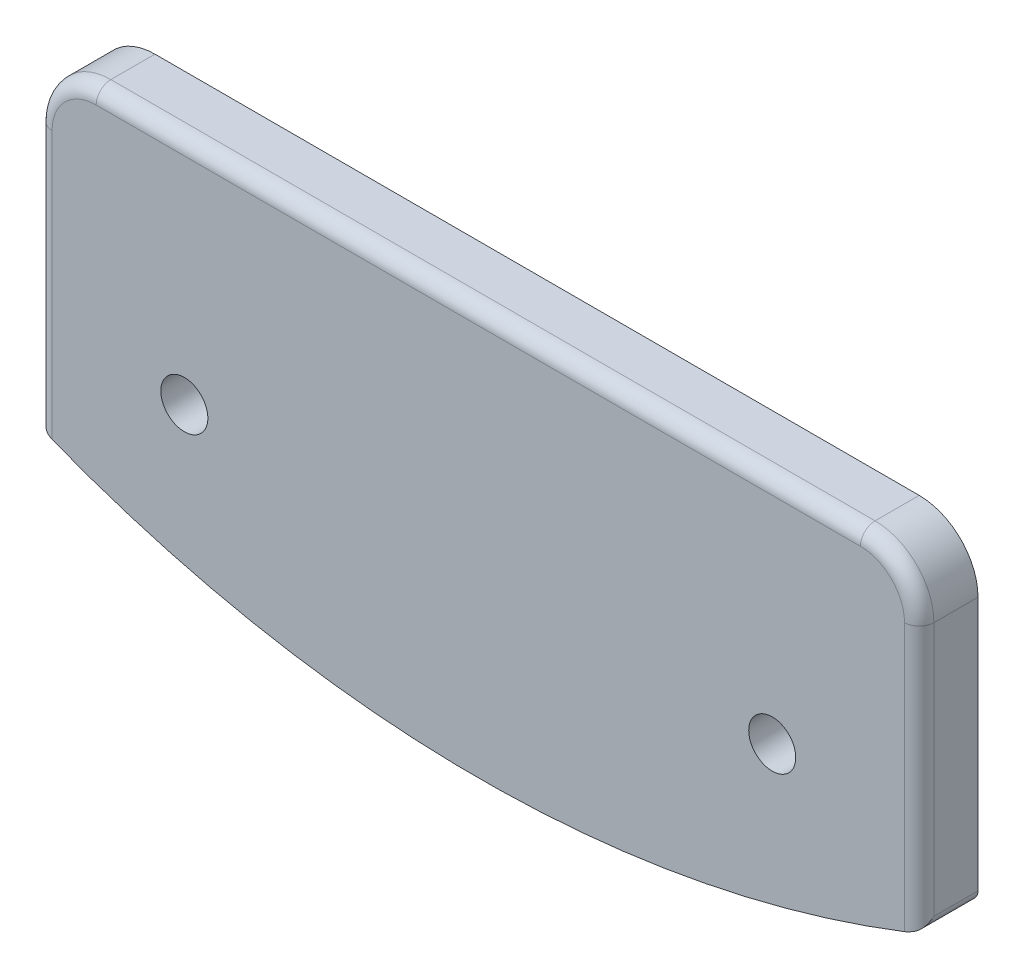
ISO-10303-21;
HEADER;
FILE_DESCRIPTION(('STEP AP214'),'2;1');
FILE_NAME('part.step','',(''),(''),'','','');
FILE_SCHEMA(('AUTOMOTIVE_DESIGN { 1 0 10303 214 1 1 1 1 }'));
ENDSEC;
DATA;
#1=APPLICATION_CONTEXT('core data for automotive mechanical design processes');
#2=APPLICATION_PROTOCOL_DEFINITION('international standard','automotive_design',2000,#1);
#3=PRODUCT_CONTEXT('',#1,'mechanical');
#4=PRODUCT('Part','Part','',(#3));
#5=PRODUCT_RELATED_PRODUCT_CATEGORY('part','',(#4));
#6=PRODUCT_DEFINITION_FORMATION('','',#4);
#7=PRODUCT_DEFINITION_CONTEXT('part definition',#1,'design');
#8=PRODUCT_DEFINITION('design','',#6,#7);
#9=PRODUCT_DEFINITION_SHAPE('','',#8);
#10=(LENGTH_UNIT() NAMED_UNIT(*) SI_UNIT(.MILLI.,.METRE.));
#11=(NAMED_UNIT(*) PLANE_ANGLE_UNIT() SI_UNIT($,.RADIAN.));
#12=(NAMED_UNIT(*) SI_UNIT($,.STERADIAN.) SOLID_ANGLE_UNIT());
#13=UNCERTAINTY_MEASURE_WITH_UNIT(LENGTH_MEASURE(1.E-05),#10,'distance_accuracy_value','');
#14=(GEOMETRIC_REPRESENTATION_CONTEXT(3) GLOBAL_UNCERTAINTY_ASSIGNED_CONTEXT((#13)) GLOBAL_UNIT_ASSIGNED_CONTEXT((#10,
#11,#12)) REPRESENTATION_CONTEXT('',''));
#15=CARTESIAN_POINT('',(0.,0.,0.));
#16=DIRECTION('',(0.,0.,1.));
#17=DIRECTION('',(1.,0.,0.));
#18=AXIS2_PLACEMENT_3D('',#15,#16,#17);
#19=CARTESIAN_POINT('',(26.0000196187948,-56.3500154002329,0.));
#20=DIRECTION('',(0.,0.,1.));
#21=DIRECTION('',(1.,0.,0.));
#22=AXIS2_PLACEMENT_3D('',#19,#20,#21);
#23=PLANE('',#22);
#24=CARTESIAN_POINT('',(0.,0.,0.));
#25=DIRECTION('',(0.,0.,1.));
#26=DIRECTION('',(1.,0.,0.));
#27=AXIS2_PLACEMENT_3D('',#24,#25,#26);
#28=CIRCLE('',#27,80.);
#29=CARTESIAN_POINT('',(-29.5268336845878,-74.3516381296518,0.));
#30=VERTEX_POINT('',#29);
#31=CARTESIAN_POINT('',(29.5268336845878,-74.3516381296518,0.));
#32=VERTEX_POINT('',#31);
#33=EDGE_CURVE('E259',#30,#32,#28,.T.);
#34=ORIENTED_EDGE('',*,*,#33,.F.);
#35=CARTESIAN_POINT('',(-29.2500196187948,-73.6545915221863,0.));
#36=DIRECTION('',(0.,0.,1.));
#37=DIRECTION('',(1.,0.,0.));
#38=AXIS2_PLACEMENT_3D('',#35,#36,#37);
#39=CIRCLE('',#38,0.75);
#40=CARTESIAN_POINT('',(-30.0000196187948,-73.6545915221863,0.));
#41=VERTEX_POINT('',#40);
#42=EDGE_CURVE('E495',#30,#41,#39,.F.);
#43=ORIENTED_EDGE('',*,*,#42,.T.);
#44=DIRECTION('',(0.,-1.,0.));
#45=VECTOR('',#44,1.);
#46=CARTESIAN_POINT('',(-30.0000196187948,-56.3500154002329,0.));
#47=LINE('',#46,#45);
#48=CARTESIAN_POINT('',(-30.0000196187948,-56.3500154002329,0.));
#49=VERTEX_POINT('',#48);
#50=EDGE_CURVE('E257',#49,#41,#47,.T.);
#51=ORIENTED_EDGE('',*,*,#50,.F.);
#52=CARTESIAN_POINT('',(-26.0000196187948,-56.3500154002329,0.));
#53=DIRECTION('',(0.,0.,1.));
#54=DIRECTION('',(-1.,0.,0.));
#55=AXIS2_PLACEMENT_3D('',#52,#53,#54);
#56=CIRCLE('',#55,4.);
#57=CARTESIAN_POINT('',(-26.0000196187948,-52.3500154002329,0.));
#58=VERTEX_POINT('',#57);
#59=EDGE_CURVE('E254',#58,#49,#56,.T.);
#60=ORIENTED_EDGE('',*,*,#59,.F.);
#61=DIRECTION('',(-1.,0.,0.));
#62=VECTOR('',#61,1.);
#63=CARTESIAN_POINT('',(-26.0000196187948,-52.3500154002329,0.));
#64=LINE('',#63,#62);
#65=CARTESIAN_POINT('',(26.0000196187948,-52.3500154002329,0.));
#66=VERTEX_POINT('',#65);
#67=EDGE_CURVE('E251',#66,#58,#64,.T.);
#68=ORIENTED_EDGE('',*,*,#67,.F.);
#69=CARTESIAN_POINT('',(26.0000196187948,-56.3500154002329,0.));
#70=DIRECTION('',(0.,0.,1.));
#71=DIRECTION('',(1.,0.,0.));
#72=AXIS2_PLACEMENT_3D('',#69,#70,#71);
#73=CIRCLE('',#72,4.00000000000001);
#74=CARTESIAN_POINT('',(30.0000196187948,-56.3500154002329,0.));
#75=VERTEX_POINT('',#74);
#76=EDGE_CURVE('E243',#75,#66,#73,.T.);
#77=ORIENTED_EDGE('',*,*,#76,.F.);
#78=DIRECTION('',(0.,1.,0.));
#79=VECTOR('',#78,1.);
#80=CARTESIAN_POINT('',(30.0000196187948,-56.3500154002329,0.));
#81=LINE('',#80,#79);
#82=CARTESIAN_POINT('',(30.0000196187948,-73.6545915221863,0.));
#83=VERTEX_POINT('',#82);
#84=EDGE_CURVE('E262',#83,#75,#81,.T.);
#85=ORIENTED_EDGE('',*,*,#84,.F.);
#86=CARTESIAN_POINT('',(29.2500196187948,-73.6545915221863,0.));
#87=DIRECTION('',(0.,0.,1.));
#88=DIRECTION('',(1.,0.,0.));
#89=AXIS2_PLACEMENT_3D('',#86,#87,#88);
#90=CIRCLE('',#89,0.75);
#91=EDGE_CURVE('E493',#83,#32,#90,.F.);
#92=ORIENTED_EDGE('',*,*,#91,.T.);
#93=EDGE_LOOP('',(#34,#43,#51,#60,#68,#77,#85,#92));
#94=FACE_BOUND('',#93,.T.);
#95=DIRECTION('',(1.,0.,0.));
#96=VECTOR('',#95,1.);
#97=CARTESIAN_POINT('',(-29.0000196187948,-63.9999798183622,0.));
#98=LINE('',#97,#96);
#99=CARTESIAN_POINT('',(-28.0000196187948,-63.9999798183622,0.));
#100=VERTEX_POINT('',#99);
#101=CARTESIAN_POINT('',(4.64999603781112,-63.9999798183622,0.));
#102=VERTEX_POINT('',#101);
#103=EDGE_CURVE('E443',#100,#102,#98,.T.);
#104=ORIENTED_EDGE('',*,*,#103,.T.);
#105=CARTESIAN_POINT('',(4.64999603781112,-62.9999798183622,0.));
#106=DIRECTION('',(0.,0.,1.));
#107=DIRECTION('',(1.,0.,0.));
#108=AXIS2_PLACEMENT_3D('',#105,#106,#107);
#109=CIRCLE('',#108,1.);
#110=CARTESIAN_POINT('',(5.64999603781112,-62.9999798183622,0.));
#111=VERTEX_POINT('',#110);
#112=EDGE_CURVE('E289',#102,#111,#109,.T.);
#113=ORIENTED_EDGE('',*,*,#112,.T.);
#114=DIRECTION('',(0.,1.,0.));
#115=VECTOR('',#114,1.);
#116=CARTESIAN_POINT('',(5.64999603781112,-56.3500154002329,0.));
#117=LINE('',#116,#115);
#118=CARTESIAN_POINT('',(5.64999603781112,-56.3500154002329,0.));
#119=VERTEX_POINT('',#118);
#120=EDGE_CURVE('E442',#111,#119,#117,.T.);
#121=ORIENTED_EDGE('',*,*,#120,.T.);
#122=CARTESIAN_POINT('',(2.64999603781112,-56.3500154002329,0.));
#123=DIRECTION('',(0.,0.,1.));
#124=DIRECTION('',(1.,0.,0.));
#125=AXIS2_PLACEMENT_3D('',#122,#123,#124);
#126=CIRCLE('',#125,3.);
#127=CARTESIAN_POINT('',(2.64999603781112,-53.3500154002329,0.));
#128=VERTEX_POINT('',#127);
#129=EDGE_CURVE('E453',#119,#128,#126,.T.);
#130=ORIENTED_EDGE('',*,*,#129,.T.);
#131=DIRECTION('',(-1.,0.,0.));
#132=VECTOR('',#131,1.);
#133=CARTESIAN_POINT('',(-26.0000196187948,-53.3500154002329,0.));
#134=LINE('',#133,#132);
#135=CARTESIAN_POINT('',(-26.0000196187948,-53.3500154002329,0.));
#136=VERTEX_POINT('',#135);
#137=EDGE_CURVE('E239',#128,#136,#134,.T.);
#138=ORIENTED_EDGE('',*,*,#137,.T.);
#139=CARTESIAN_POINT('',(-26.0000196187948,-56.3500154002329,0.));
#140=DIRECTION('',(0.,0.,1.));
#141=DIRECTION('',(1.,0.,0.));
#142=AXIS2_PLACEMENT_3D('',#139,#140,#141);
#143=CIRCLE('',#142,3.);
#144=CARTESIAN_POINT('',(-29.0000196187948,-56.3500154002329,0.));
#145=VERTEX_POINT('',#144);
#146=EDGE_CURVE('E456',#136,#145,#143,.T.);
#147=ORIENTED_EDGE('',*,*,#146,.T.);
#148=DIRECTION('',(0.,-1.,0.));
#149=VECTOR('',#148,1.);
#150=CARTESIAN_POINT('',(-29.0000196187948,-56.3500154002329,0.));
#151=LINE('',#150,#149);
#152=CARTESIAN_POINT('',(-29.0000196187948,-62.9999798183622,0.));
#153=VERTEX_POINT('',#152);
#154=EDGE_CURVE('E459',#145,#153,#151,.T.);
#155=ORIENTED_EDGE('',*,*,#154,.T.);
#156=CARTESIAN_POINT('',(-28.0000196187948,-62.9999798183622,0.));
#157=DIRECTION('',(0.,0.,1.));
#158=DIRECTION('',(1.,0.,0.));
#159=AXIS2_PLACEMENT_3D('',#156,#157,#158);
#160=CIRCLE('',#159,1.);
#161=EDGE_CURVE('E287',#153,#100,#160,.T.);
#162=ORIENTED_EDGE('',*,*,#161,.T.);
#163=EDGE_LOOP('',(#104,#113,#121,#130,#138,#147,#155,#162));
#164=FACE_BOUND('',#163,.T.);
#165=CARTESIAN_POINT('',(20.,-68.,0.));
#166=DIRECTION('',(0.,0.,1.));
#167=DIRECTION('',(-1.,0.,0.));
#168=AXIS2_PLACEMENT_3D('',#165,#166,#167);
#169=CIRCLE('',#168,1.6);
#170=CARTESIAN_POINT('',(18.4,-68.,0.));
#171=VERTEX_POINT('',#170);
#172=EDGE_CURVE('E439',#171,#171,#169,.T.);
#173=ORIENTED_EDGE('',*,*,#172,.T.);
#174=EDGE_LOOP('',(#173));
#175=FACE_BOUND('',#174,.T.);
#176=CARTESIAN_POINT('',(-20.,-68.,0.));
#177=DIRECTION('',(0.,0.,1.));
#178=DIRECTION('',(1.,0.,0.));
#179=AXIS2_PLACEMENT_3D('',#176,#177,#178);
#180=CIRCLE('',#179,1.6);
#181=CARTESIAN_POINT('',(-18.4,-68.,0.));
#182=VERTEX_POINT('',#181);
#183=EDGE_CURVE('E436',#182,#182,#180,.T.);
#184=ORIENTED_EDGE('',*,*,#183,.T.);
#185=EDGE_LOOP('',(#184));
#186=FACE_BOUND('',#185,.T.);
#187=ADVANCED_FACE('F77',(#94,#164,#175,#186),#23,.F.);
#188=CARTESIAN_POINT('',(26.0000196187948,-56.3500154002329,2.5));
#189=DIRECTION('',(0.,0.,-1.));
#190=DIRECTION('',(-1.,0.,0.));
#191=AXIS2_PLACEMENT_3D('',#188,#189,#190);
#192=CYLINDRICAL_SURFACE('',#191,4.00000000000001);
#193=DIRECTION('',(0.,0.,-1.));
#194=VECTOR('',#193,1.);
#195=CARTESIAN_POINT('',(26.0000196187948,-52.3500154002329,2.5));
#196=LINE('',#195,#194);
#197=CARTESIAN_POINT('',(26.0000196187948,-52.3500154002329,3.));
#198=VERTEX_POINT('',#197);
#199=EDGE_CURVE('E271',#198,#66,#196,.T.);
#200=ORIENTED_EDGE('',*,*,#199,.F.);
#201=CARTESIAN_POINT('',(26.0000196187948,-56.3500154002329,3.));
#202=DIRECTION('',(0.,0.,1.));
#203=DIRECTION('',(1.,0.,0.));
#204=AXIS2_PLACEMENT_3D('',#201,#202,#203);
#205=CIRCLE('',#204,4.00000000000001);
#206=CARTESIAN_POINT('',(30.0000196187948,-56.3500154002329,3.));
#207=VERTEX_POINT('',#206);
#208=EDGE_CURVE('E516',#198,#207,#205,.F.);
#209=ORIENTED_EDGE('',*,*,#208,.T.);
#210=DIRECTION('',(0.,0.,-1.));
#211=VECTOR('',#210,1.);
#212=CARTESIAN_POINT('',(30.0000196187948,-56.3500154002329,2.5));
#213=LINE('',#212,#211);
#214=EDGE_CURVE('E264',#207,#75,#213,.T.);
#215=ORIENTED_EDGE('',*,*,#214,.T.);
#216=ORIENTED_EDGE('',*,*,#76,.T.);
#217=EDGE_LOOP('',(#200,#209,#215,#216));
#218=FACE_BOUND('',#217,.T.);
#219=ADVANCED_FACE('F341',(#218),#192,.T.);
#220=CARTESIAN_POINT('',(-26.0000196187948,-52.3500154002329,2.5));
#221=DIRECTION('',(0.,-1.,0.));
#222=DIRECTION('',(1.,0.,0.));
#223=AXIS2_PLACEMENT_3D('',#220,#221,#222);
#224=PLANE('',#223);
#225=DIRECTION('',(0.,0.,-1.));
#226=VECTOR('',#225,1.);
#227=CARTESIAN_POINT('',(-26.0000196187948,-52.3500154002329,2.5));
#228=LINE('',#227,#226);
#229=CARTESIAN_POINT('',(-26.0000196187948,-52.3500154002329,3.));
#230=VERTEX_POINT('',#229);
#231=EDGE_CURVE('E269',#230,#58,#228,.T.);
#232=ORIENTED_EDGE('',*,*,#231,.F.);
#233=DIRECTION('',(-1.,0.,0.));
#234=VECTOR('',#233,1.);
#235=CARTESIAN_POINT('',(26.0000196187948,-52.3500154002329,3.));
#236=LINE('',#235,#234);
#237=EDGE_CURVE('E490',#230,#198,#236,.F.);
#238=ORIENTED_EDGE('',*,*,#237,.T.);
#239=ORIENTED_EDGE('',*,*,#199,.T.);
#240=ORIENTED_EDGE('',*,*,#67,.T.);
#241=EDGE_LOOP('',(#232,#238,#239,#240));
#242=FACE_BOUND('',#241,.T.);
#243=ADVANCED_FACE('F337',(#242),#224,.F.);
#244=CARTESIAN_POINT('',(-26.0000196187948,-56.3500154002329,2.5));
#245=DIRECTION('',(0.,0.,-1.));
#246=DIRECTION('',(-1.,0.,0.));
#247=AXIS2_PLACEMENT_3D('',#244,#245,#246);
#248=CYLINDRICAL_SURFACE('',#247,4.);
#249=DIRECTION('',(0.,0.,-1.));
#250=VECTOR('',#249,1.);
#251=CARTESIAN_POINT('',(-30.0000196187948,-56.3500154002329,2.5));
#252=LINE('',#251,#250);
#253=CARTESIAN_POINT('',(-30.0000196187948,-56.3500154002329,3.));
#254=VERTEX_POINT('',#253);
#255=EDGE_CURVE('E267',#254,#49,#252,.T.);
#256=ORIENTED_EDGE('',*,*,#255,.F.);
#257=CARTESIAN_POINT('',(-26.0000196187948,-56.3500154002329,3.));
#258=DIRECTION('',(0.,0.,1.));
#259=DIRECTION('',(1.,0.,0.));
#260=AXIS2_PLACEMENT_3D('',#257,#258,#259);
#261=CIRCLE('',#260,4.);
#262=EDGE_CURVE('E520',#254,#230,#261,.F.);
#263=ORIENTED_EDGE('',*,*,#262,.T.);
#264=ORIENTED_EDGE('',*,*,#231,.T.);
#265=ORIENTED_EDGE('',*,*,#59,.T.);
#266=EDGE_LOOP('',(#256,#263,#264,#265));
#267=FACE_BOUND('',#266,.T.);
#268=ADVANCED_FACE('F334',(#267),#248,.T.);
#269=CARTESIAN_POINT('',(-30.0000196187948,-56.3500154002329,2.5));
#270=DIRECTION('',(1.,0.,0.));
#271=DIRECTION('',(0.,1.,0.));
#272=AXIS2_PLACEMENT_3D('',#269,#270,#271);
#273=PLANE('',#272);
#274=ORIENTED_EDGE('',*,*,#50,.T.);
#275=DIRECTION('',(0.,0.,-1.));
#276=VECTOR('',#275,1.);
#277=CARTESIAN_POINT('',(-30.0000196187948,-73.6545915221863,2.5));
#278=LINE('',#277,#276);
#279=CARTESIAN_POINT('',(-30.0000196187948,-73.6545915221863,3.));
#280=VERTEX_POINT('',#279);
#281=EDGE_CURVE('E104',#41,#280,#278,.F.);
#282=ORIENTED_EDGE('',*,*,#281,.T.);
#283=DIRECTION('',(0.,1.,0.));
#284=VECTOR('',#283,1.);
#285=CARTESIAN_POINT('',(-30.0000196187948,-56.3500154002329,3.));
#286=LINE('',#285,#284);
#287=EDGE_CURVE('E514',#280,#254,#286,.T.);
#288=ORIENTED_EDGE('',*,*,#287,.T.);
#289=ORIENTED_EDGE('',*,*,#255,.T.);
#290=EDGE_LOOP('',(#274,#282,#288,#289));
#291=FACE_BOUND('',#290,.T.);
#292=ADVANCED_FACE('F328',(#291),#273,.F.);
#293=CARTESIAN_POINT('',(0.,0.,2.5));
#294=DIRECTION('',(0.,0.,-1.));
#295=DIRECTION('',(-1.,0.,0.));
#296=AXIS2_PLACEMENT_3D('',#293,#294,#295);
#297=CYLINDRICAL_SURFACE('',#296,80.);
#298=CARTESIAN_POINT('',(-29.0000196187948,-74.5586940745982,4.));
#299=CARTESIAN_POINT('',(-29.0596066132517,-74.5355205735566,4.00003040887928));
#300=CARTESIAN_POINT('',(-29.1191707824708,-74.5122674149781,3.99467519871337));
#301=CARTESIAN_POINT('',(-29.2366749276347,-74.4662386559322,3.9734207634563));
#302=CARTESIAN_POINT('',(-29.2946125126244,-74.4434637697249,3.95750678524867));
#303=CARTESIAN_POINT('',(-29.4071707532458,-74.3990726286106,3.91534006679412));
#304=CARTESIAN_POINT('',(-29.4617876831406,-74.3774576782158,3.88907595219497));
#305=CARTESIAN_POINT('',(-29.5658726273493,-74.3361439804414,3.82673141956986));
#306=CARTESIAN_POINT('',(-29.6153444675297,-74.3164438099633,3.79065836862866));
#307=CARTESIAN_POINT('',(-29.7057964856069,-74.2803335388721,3.71090575298693));
#308=CARTESIAN_POINT('',(-29.7470131973515,-74.2638324456298,3.66753646207224));
#309=CARTESIAN_POINT('',(-29.8214594050831,-74.2339691266905,3.57343766371094));
#310=CARTESIAN_POINT('',(-29.8546895600229,-74.2206066420358,3.52270876404342));
#311=CARTESIAN_POINT('',(-29.9096499582194,-74.1984747662587,3.41923739568762));
#312=CARTESIAN_POINT('',(-29.9320300726255,-74.1894462717466,3.36689482698829));
#313=CARTESIAN_POINT('',(-29.9676331731695,-74.1750722059981,3.25874777742881));
#314=CARTESIAN_POINT('',(-29.9808721471293,-74.1697202046726,3.20294952781644));
#315=CARTESIAN_POINT('',(-29.9928330734515,-74.1648837093477,3.12216735514846));
#316=CARTESIAN_POINT('',(-29.9955273217284,-74.1637940334967,3.09780654222436));
#317=CARTESIAN_POINT('',(-29.9991189390364,-74.1623412902509,3.04896821148646));
#318=CARTESIAN_POINT('',(-30.0000190078712,-74.1619771311305,3.02449092466167));
#319=CARTESIAN_POINT('',(-30.0000196187948,-74.1619769347604,3.));
#320=B_SPLINE_CURVE_WITH_KNOTS('',3,(#298,#299,#300,#301,#302,#303,#304,#305,#306,#307,#308,
#309,#310,#311,#312,#313,#314,#315,#316,#317,#318,#319),.UNSPECIFIED.,.F.,.F.,(4,2,2,2,2,2,2,2,
2,2,4),(0.,0.191595903311774,0.383460077132389,0.575535692021743,0.767467443458432,
0.952684305639938,1.13788588074229,1.30991380439227,1.4816400844466,1.55517737896761,
1.62860393396581),.UNSPECIFIED.);
#321=CARTESIAN_POINT('',(-29.0000196187948,-74.5586940745982,4.));
#322=VERTEX_POINT('',#321);
#323=CARTESIAN_POINT('',(-29.5268336845878,-74.3516381296518,3.84998055276732));
#324=VERTEX_POINT('',#323);
#325=EDGE_CURVE('E304',#322,#324,#320,.T.);
#326=ORIENTED_EDGE('',*,*,#325,.T.);
#327=DIRECTION('',(0.,0.,-1.));
#328=VECTOR('',#327,1.);
#329=CARTESIAN_POINT('',(-29.5268336845878,-74.3516381296518,2.5));
#330=LINE('',#329,#328);
#331=EDGE_CURVE('E489',#324,#30,#330,.T.);
#332=ORIENTED_EDGE('',*,*,#331,.T.);
#333=ORIENTED_EDGE('',*,*,#33,.T.);
#334=DIRECTION('',(0.,0.,-1.));
#335=VECTOR('',#334,1.);
#336=CARTESIAN_POINT('',(29.5268336845879,-74.3516381296518,2.5));
#337=LINE('',#336,#335);
#338=CARTESIAN_POINT('',(29.5268336845878,-74.3516381296518,3.84998055276733));
#339=VERTEX_POINT('',#338);
#340=EDGE_CURVE('E487',#32,#339,#337,.F.);
#341=ORIENTED_EDGE('',*,*,#340,.T.);
#342=CARTESIAN_POINT('',(30.0000196187948,-74.1619769347604,3.));
#343=CARTESIAN_POINT('',(30.0000204471864,-74.1619765117537,3.02667039500805));
#344=CARTESIAN_POINT('',(29.9989519060468,-74.1624088549921,3.05332742731168));
#345=CARTESIAN_POINT('',(29.9946958227748,-74.1641303488611,3.10643860030182));
#346=CARTESIAN_POINT('',(29.991508708532,-74.1654193264765,3.13289278086731));
#347=CARTESIAN_POINT('',(29.9788292751922,-74.1705459288987,3.21151195535693));
#348=CARTESIAN_POINT('',(29.9662185319932,-74.1756433682887,3.26313007202984));
#349=CARTESIAN_POINT('',(29.9331807355927,-74.188981685613,3.36331344022252));
#350=CARTESIAN_POINT('',(29.912755713902,-74.1972217465452,3.41187948138584));
#351=CARTESIAN_POINT('',(29.8648395732017,-74.2165212214526,3.50479630164745));
#352=CARTESIAN_POINT('',(29.8373455806723,-74.2275817819393,3.54914535648474));
#353=CARTESIAN_POINT('',(29.7752714879351,-74.2525040445443,3.63389957877525));
#354=CARTESIAN_POINT('',(29.7404993988107,-74.2664414580651,3.67414142756564));
#355=CARTESIAN_POINT('',(29.6655161872453,-74.2964250738845,3.74826164768769));
#356=CARTESIAN_POINT('',(29.625303620626,-74.3124718360789,3.7821383236569));
#357=CARTESIAN_POINT('',(29.5376242375645,-74.3473679879536,3.84503805213167));
#358=CARTESIAN_POINT('',(29.4898483517624,-74.366334352758,3.87356503982904));
#359=CARTESIAN_POINT('',(29.3906759485487,-74.4055845638369,3.92219275432681));
#360=CARTESIAN_POINT('',(29.3392782216078,-74.4258688500589,3.94229065046985));
#361=CARTESIAN_POINT('',(29.2401314996153,-74.4648723002924,3.97196332501763));
#362=CARTESIAN_POINT('',(29.1926258096567,-74.4835095729307,3.98247007043714));
#363=CARTESIAN_POINT('',(29.0967605231391,-74.5210119718934,3.99648880931951));
#364=CARTESIAN_POINT('',(29.0484022415218,-74.5398767352101,4.0000107606433));
#365=CARTESIAN_POINT('',(29.0000196187948,-74.5586940745981,4.));
#366=B_SPLINE_CURVE_WITH_KNOTS('',3,(#342,#343,#344,#345,#346,#347,#348,#349,#350,#351,#352,
#353,#354,#355,#356,#357,#358,#359,#360,#361,#362,#363,#364,#365),.UNSPECIFIED.,.F.,.F.,(4,2,2,
2,2,2,2,2,2,2,2,4),(0.,0.0799600506266316,0.159903956570993,0.319210093359065,0.478474842770324,
0.637804435559398,0.802036023955479,0.966311293583594,1.14191945229099,1.31758653659783,
1.47341836946172,1.62902788075246),.UNSPECIFIED.);
#367=CARTESIAN_POINT('',(29.0000196187948,-74.5586940745981,4.));
#368=VERTEX_POINT('',#367);
#369=EDGE_CURVE('E313',#339,#368,#366,.T.);
#370=ORIENTED_EDGE('',*,*,#369,.T.);
#371=CARTESIAN_POINT('',(0.,0.,4.));
#372=DIRECTION('',(0.,0.,1.));
#373=DIRECTION('',(1.,0.,0.));
#374=AXIS2_PLACEMENT_3D('',#371,#372,#373);
#375=CIRCLE('',#374,80.);
#376=EDGE_CURVE('E419',#322,#368,#375,.T.);
#377=ORIENTED_EDGE('',*,*,#376,.F.);
#378=EDGE_LOOP('',(#326,#332,#333,#341,#370,#377));
#379=FACE_BOUND('',#378,.T.);
#380=ADVANCED_FACE('F322',(#379),#297,.T.);
#381=CARTESIAN_POINT('',(30.0000196187948,-56.3500154002329,2.5));
#382=DIRECTION('',(-1.,0.,0.));
#383=DIRECTION('',(0.,-1.,0.));
#384=AXIS2_PLACEMENT_3D('',#381,#382,#383);
#385=PLANE('',#384);
#386=DIRECTION('',(0.,1.,0.));
#387=VECTOR('',#386,1.);
#388=CARTESIAN_POINT('',(30.0000196187948,-74.1619769347604,3.));
#389=LINE('',#388,#387);
#390=CARTESIAN_POINT('',(30.0000196187948,-73.6545915221863,3.));
#391=VERTEX_POINT('',#390);
#392=EDGE_CURVE('E302',#207,#391,#389,.F.);
#393=ORIENTED_EDGE('',*,*,#392,.T.);
#394=DIRECTION('',(0.,0.,-1.));
#395=VECTOR('',#394,1.);
#396=CARTESIAN_POINT('',(30.0000196187948,-73.6545915221863,2.5));
#397=LINE('',#396,#395);
#398=EDGE_CURVE('E91',#391,#83,#397,.T.);
#399=ORIENTED_EDGE('',*,*,#398,.T.);
#400=ORIENTED_EDGE('',*,*,#84,.T.);
#401=ORIENTED_EDGE('',*,*,#214,.F.);
#402=EDGE_LOOP('',(#393,#399,#400,#401));
#403=FACE_BOUND('',#402,.T.);
#404=ADVANCED_FACE('F327',(#403),#385,.F.);
#405=CARTESIAN_POINT('',(5.64999603781112,-56.3500154002329,2.5));
#406=DIRECTION('',(-1.,0.,0.));
#407=DIRECTION('',(0.,-1.,0.));
#408=AXIS2_PLACEMENT_3D('',#405,#406,#407);
#409=PLANE('',#408);
#410=ORIENTED_EDGE('',*,*,#120,.F.);
#411=DIRECTION('',(0.,0.,-1.));
#412=VECTOR('',#411,1.);
#413=CARTESIAN_POINT('',(5.64999603781112,-62.9999798183622,2.5));
#414=LINE('',#413,#412);
#415=CARTESIAN_POINT('',(5.64999603781112,-62.9999798183622,2.5));
#416=VERTEX_POINT('',#415);
#417=EDGE_CURVE('E285',#111,#416,#414,.F.);
#418=ORIENTED_EDGE('',*,*,#417,.T.);
#419=DIRECTION('',(0.,1.,0.));
#420=VECTOR('',#419,1.);
#421=CARTESIAN_POINT('',(5.64999603781112,-56.3500154002329,2.5));
#422=LINE('',#421,#420);
#423=CARTESIAN_POINT('',(5.64999603781112,-56.3500154002329,2.5));
#424=VERTEX_POINT('',#423);
#425=EDGE_CURVE('E235',#416,#424,#422,.T.);
#426=ORIENTED_EDGE('',*,*,#425,.T.);
#427=DIRECTION('',(0.,0.,-1.));
#428=VECTOR('',#427,1.);
#429=CARTESIAN_POINT('',(5.64999603781112,-56.3500154002329,2.5));
#430=LINE('',#429,#428);
#431=EDGE_CURVE('E234',#424,#119,#430,.T.);
#432=ORIENTED_EDGE('',*,*,#431,.T.);
#433=EDGE_LOOP('',(#410,#418,#426,#432));
#434=FACE_BOUND('',#433,.T.);
#435=ADVANCED_FACE('F382',(#434),#409,.T.);
#436=CARTESIAN_POINT('',(2.64999603781112,-56.3500154002329,2.5));
#437=DIRECTION('',(0.,0.,-1.));
#438=DIRECTION('',(-1.,0.,0.));
#439=AXIS2_PLACEMENT_3D('',#436,#437,#438);
#440=CYLINDRICAL_SURFACE('',#439,3.);
#441=ORIENTED_EDGE('',*,*,#129,.F.);
#442=ORIENTED_EDGE('',*,*,#431,.F.);
#443=CARTESIAN_POINT('',(2.64999603781112,-56.3500154002329,2.5));
#444=DIRECTION('',(0.,0.,1.));
#445=DIRECTION('',(1.,0.,0.));
#446=AXIS2_PLACEMENT_3D('',#443,#444,#445);
#447=CIRCLE('',#446,3.);
#448=CARTESIAN_POINT('',(2.64999603781112,-53.3500154002329,2.5));
#449=VERTEX_POINT('',#448);
#450=EDGE_CURVE('E220',#424,#449,#447,.T.);
#451=ORIENTED_EDGE('',*,*,#450,.T.);
#452=DIRECTION('',(0.,0.,-1.));
#453=VECTOR('',#452,1.);
#454=CARTESIAN_POINT('',(2.64999603781112,-53.3500154002329,2.5));
#455=LINE('',#454,#453);
#456=EDGE_CURVE('E231',#449,#128,#455,.T.);
#457=ORIENTED_EDGE('',*,*,#456,.T.);
#458=EDGE_LOOP('',(#441,#442,#451,#457));
#459=FACE_BOUND('',#458,.T.);
#460=ADVANCED_FACE('F230',(#459),#440,.F.);
#461=CARTESIAN_POINT('',(-26.0000196187948,-53.3500154002329,2.5));
#462=DIRECTION('',(0.,-1.,0.));
#463=DIRECTION('',(0.,0.,-1.));
#464=AXIS2_PLACEMENT_3D('',#461,#462,#463);
#465=PLANE('',#464);
#466=ORIENTED_EDGE('',*,*,#137,.F.);
#467=ORIENTED_EDGE('',*,*,#456,.F.);
#468=DIRECTION('',(-1.,0.,0.));
#469=VECTOR('',#468,1.);
#470=CARTESIAN_POINT('',(-26.0000196187948,-53.3500154002329,2.5));
#471=LINE('',#470,#469);
#472=CARTESIAN_POINT('',(-26.0000196187948,-53.3500154002329,2.5));
#473=VERTEX_POINT('',#472);
#474=EDGE_CURVE('E215',#449,#473,#471,.T.);
#475=ORIENTED_EDGE('',*,*,#474,.T.);
#476=DIRECTION('',(0.,0.,-1.));
#477=VECTOR('',#476,1.);
#478=CARTESIAN_POINT('',(-26.0000196187948,-53.3500154002329,2.5));
#479=LINE('',#478,#477);
#480=EDGE_CURVE('E241',#473,#136,#479,.T.);
#481=ORIENTED_EDGE('',*,*,#480,.T.);
#482=EDGE_LOOP('',(#466,#467,#475,#481));
#483=FACE_BOUND('',#482,.T.);
#484=ADVANCED_FACE('F237',(#483),#465,.T.);
#485=CARTESIAN_POINT('',(-26.0000196187948,-56.3500154002329,2.5));
#486=DIRECTION('',(0.,0.,-1.));
#487=DIRECTION('',(-1.,0.,0.));
#488=AXIS2_PLACEMENT_3D('',#485,#486,#487);
#489=CYLINDRICAL_SURFACE('',#488,3.);
#490=ORIENTED_EDGE('',*,*,#146,.F.);
#491=ORIENTED_EDGE('',*,*,#480,.F.);
#492=CARTESIAN_POINT('',(-26.0000196187948,-56.3500154002329,2.5));
#493=DIRECTION('',(0.,0.,1.));
#494=DIRECTION('',(1.,0.,0.));
#495=AXIS2_PLACEMENT_3D('',#492,#493,#494);
#496=CIRCLE('',#495,3.);
#497=CARTESIAN_POINT('',(-29.0000196187948,-56.3500154002329,2.5));
#498=VERTEX_POINT('',#497);
#499=EDGE_CURVE('E223',#473,#498,#496,.T.);
#500=ORIENTED_EDGE('',*,*,#499,.T.);
#501=DIRECTION('',(0.,0.,-1.));
#502=VECTOR('',#501,1.);
#503=CARTESIAN_POINT('',(-29.0000196187948,-56.3500154002329,2.5));
#504=LINE('',#503,#502);
#505=EDGE_CURVE('E245',#498,#145,#504,.T.);
#506=ORIENTED_EDGE('',*,*,#505,.T.);
#507=EDGE_LOOP('',(#490,#491,#500,#506));
#508=FACE_BOUND('',#507,.T.);
#509=ADVANCED_FACE('F390',(#508),#489,.F.);
#510=CARTESIAN_POINT('',(-29.0000196187948,-56.3500154002329,2.5));
#511=DIRECTION('',(1.,0.,0.));
#512=DIRECTION('',(0.,0.,-1.));
#513=AXIS2_PLACEMENT_3D('',#510,#511,#512);
#514=PLANE('',#513);
#515=DIRECTION('',(0.,-1.,0.));
#516=VECTOR('',#515,1.);
#517=CARTESIAN_POINT('',(-29.0000196187948,-56.3500154002329,2.5));
#518=LINE('',#517,#516);
#519=CARTESIAN_POINT('',(-29.0000196187948,-62.9999798183622,2.5));
#520=VERTEX_POINT('',#519);
#521=EDGE_CURVE('E446',#498,#520,#518,.T.);
#522=ORIENTED_EDGE('',*,*,#521,.T.);
#523=DIRECTION('',(0.,0.,-1.));
#524=VECTOR('',#523,1.);
#525=CARTESIAN_POINT('',(-29.0000196187948,-62.9999798183622,0.));
#526=LINE('',#525,#524);
#527=EDGE_CURVE('E273',#520,#153,#526,.T.);
#528=ORIENTED_EDGE('',*,*,#527,.T.);
#529=ORIENTED_EDGE('',*,*,#154,.F.);
#530=ORIENTED_EDGE('',*,*,#505,.F.);
#531=EDGE_LOOP('',(#522,#528,#529,#530));
#532=FACE_BOUND('',#531,.T.);
#533=ADVANCED_FACE('F393',(#532),#514,.T.);
#534=CARTESIAN_POINT('',(-29.0000196187948,-63.9999798183622,2.5));
#535=DIRECTION('',(0.,1.,0.));
#536=DIRECTION('',(0.,0.,1.));
#537=AXIS2_PLACEMENT_3D('',#534,#535,#536);
#538=PLANE('',#537);
#539=ORIENTED_EDGE('',*,*,#103,.F.);
#540=DIRECTION('',(0.,0.,-1.));
#541=VECTOR('',#540,1.);
#542=CARTESIAN_POINT('',(-28.0000196187948,-63.9999798183622,2.5));
#543=LINE('',#542,#541);
#544=CARTESIAN_POINT('',(-28.0000196187948,-63.9999798183622,2.5));
#545=VERTEX_POINT('',#544);
#546=EDGE_CURVE('E279',#100,#545,#543,.F.);
#547=ORIENTED_EDGE('',*,*,#546,.T.);
#548=DIRECTION('',(1.,0.,0.));
#549=VECTOR('',#548,1.);
#550=CARTESIAN_POINT('',(-29.0000196187948,-63.9999798183622,2.5));
#551=LINE('',#550,#549);
#552=CARTESIAN_POINT('',(4.64999603781112,-63.9999798183622,2.5));
#553=VERTEX_POINT('',#552);
#554=EDGE_CURVE('E449',#545,#553,#551,.T.);
#555=ORIENTED_EDGE('',*,*,#554,.T.);
#556=DIRECTION('',(0.,0.,-1.));
#557=VECTOR('',#556,1.);
#558=CARTESIAN_POINT('',(4.64999603781112,-63.9999798183622,0.));
#559=LINE('',#558,#557);
#560=EDGE_CURVE('E276',#553,#102,#559,.T.);
#561=ORIENTED_EDGE('',*,*,#560,.T.);
#562=EDGE_LOOP('',(#539,#547,#555,#561));
#563=FACE_BOUND('',#562,.T.);
#564=ADVANCED_FACE('F397',(#563),#538,.T.);
#565=CARTESIAN_POINT('',(20.,-68.,2.5));
#566=DIRECTION('',(0.,0.,-1.));
#567=DIRECTION('',(-1.,0.,0.));
#568=AXIS2_PLACEMENT_3D('',#565,#566,#567);
#569=CYLINDRICAL_SURFACE('',#568,1.6);
#570=ORIENTED_EDGE('',*,*,#172,.F.);
#571=EDGE_LOOP('',(#570));
#572=FACE_BOUND('',#571,.T.);
#573=CARTESIAN_POINT('',(20.,-68.,4.));
#574=DIRECTION('',(0.,0.,1.));
#575=DIRECTION('',(1.,0.,0.));
#576=AXIS2_PLACEMENT_3D('',#573,#574,#575);
#577=CIRCLE('',#576,1.6);
#578=CARTESIAN_POINT('',(21.6,-68.,4.));
#579=VERTEX_POINT('',#578);
#580=EDGE_CURVE('E427',#579,#579,#577,.T.);
#581=ORIENTED_EDGE('',*,*,#580,.T.);
#582=EDGE_LOOP('',(#581));
#583=FACE_BOUND('',#582,.T.);
#584=ADVANCED_FACE('F401',(#572,#583),#569,.F.);
#585=CARTESIAN_POINT('',(-20.,-68.,2.5));
#586=DIRECTION('',(0.,0.,-1.));
#587=DIRECTION('',(-1.,0.,0.));
#588=AXIS2_PLACEMENT_3D('',#585,#586,#587);
#589=CYLINDRICAL_SURFACE('',#588,1.6);
#590=ORIENTED_EDGE('',*,*,#183,.F.);
#591=EDGE_LOOP('',(#590));
#592=FACE_BOUND('',#591,.T.);
#593=CARTESIAN_POINT('',(-20.,-68.,4.));
#594=DIRECTION('',(0.,0.,1.));
#595=DIRECTION('',(1.,0.,0.));
#596=AXIS2_PLACEMENT_3D('',#593,#594,#595);
#597=CIRCLE('',#596,1.6);
#598=CARTESIAN_POINT('',(-18.4,-68.,4.));
#599=VERTEX_POINT('',#598);
#600=EDGE_CURVE('E424',#599,#599,#597,.T.);
#601=ORIENTED_EDGE('',*,*,#600,.T.);
#602=EDGE_LOOP('',(#601));
#603=FACE_BOUND('',#602,.T.);
#604=ADVANCED_FACE('F405',(#592,#603),#589,.F.);
#605=CARTESIAN_POINT('',(-26.0000196187948,-56.3500154002329,2.5));
#606=DIRECTION('',(0.,0.,1.));
#607=DIRECTION('',(1.,0.,0.));
#608=AXIS2_PLACEMENT_3D('',#605,#606,#607);
#609=PLANE('',#608);
#610=ORIENTED_EDGE('',*,*,#554,.F.);
#611=CARTESIAN_POINT('',(-28.0000196187948,-62.9999798183622,2.5));
#612=DIRECTION('',(0.,0.,1.));
#613=DIRECTION('',(1.,0.,0.));
#614=AXIS2_PLACEMENT_3D('',#611,#612,#613);
#615=CIRCLE('',#614,1.);
#616=EDGE_CURVE('E283',#545,#520,#615,.F.);
#617=ORIENTED_EDGE('',*,*,#616,.T.);
#618=ORIENTED_EDGE('',*,*,#521,.F.);
#619=ORIENTED_EDGE('',*,*,#499,.F.);
#620=ORIENTED_EDGE('',*,*,#474,.F.);
#621=ORIENTED_EDGE('',*,*,#450,.F.);
#622=ORIENTED_EDGE('',*,*,#425,.F.);
#623=CARTESIAN_POINT('',(4.64999603781112,-62.9999798183622,2.5));
#624=DIRECTION('',(0.,0.,1.));
#625=DIRECTION('',(1.,0.,0.));
#626=AXIS2_PLACEMENT_3D('',#623,#624,#625);
#627=CIRCLE('',#626,1.);
#628=EDGE_CURVE('E281',#416,#553,#627,.F.);
#629=ORIENTED_EDGE('',*,*,#628,.T.);
#630=EDGE_LOOP('',(#610,#617,#618,#619,#620,#621,#622,#629));
#631=FACE_BOUND('',#630,.T.);
#632=ADVANCED_FACE('F218',(#631),#609,.F.);
#633=CARTESIAN_POINT('',(-26.0000196187948,-56.3500154002329,4.));
#634=DIRECTION('',(0.,0.,1.));
#635=DIRECTION('',(1.,0.,0.));
#636=AXIS2_PLACEMENT_3D('',#633,#634,#635);
#637=PLANE('',#636);
#638=ORIENTED_EDGE('',*,*,#376,.T.);
#639=DIRECTION('',(0.,1.,0.));
#640=VECTOR('',#639,1.);
#641=CARTESIAN_POINT('',(29.0000196187948,-56.3500154002329,4.));
#642=LINE('',#641,#640);
#643=CARTESIAN_POINT('',(29.0000196187948,-56.3500154002329,4.));
#644=VERTEX_POINT('',#643);
#645=EDGE_CURVE('E299',#368,#644,#642,.T.);
#646=ORIENTED_EDGE('',*,*,#645,.T.);
#647=CARTESIAN_POINT('',(26.0000196187948,-56.3500154002329,4.));
#648=DIRECTION('',(0.,0.,1.));
#649=DIRECTION('',(1.,0.,0.));
#650=AXIS2_PLACEMENT_3D('',#647,#648,#649);
#651=CIRCLE('',#650,3.00000000000001);
#652=CARTESIAN_POINT('',(26.0000196187948,-53.3500154002329,4.));
#653=VERTEX_POINT('',#652);
#654=EDGE_CURVE('E297',#644,#653,#651,.T.);
#655=ORIENTED_EDGE('',*,*,#654,.T.);
#656=DIRECTION('',(-1.,0.,0.));
#657=VECTOR('',#656,1.);
#658=CARTESIAN_POINT('',(-26.0000196187948,-53.3500154002329,4.));
#659=LINE('',#658,#657);
#660=CARTESIAN_POINT('',(-26.0000196187948,-53.3500154002329,4.));
#661=VERTEX_POINT('',#660);
#662=EDGE_CURVE('E291',#653,#661,#659,.T.);
#663=ORIENTED_EDGE('',*,*,#662,.T.);
#664=CARTESIAN_POINT('',(-26.0000196187948,-56.3500154002329,4.));
#665=DIRECTION('',(0.,0.,1.));
#666=DIRECTION('',(1.,0.,0.));
#667=AXIS2_PLACEMENT_3D('',#664,#665,#666);
#668=CIRCLE('',#667,3.);
#669=CARTESIAN_POINT('',(-29.0000196187948,-56.3500154002329,4.));
#670=VERTEX_POINT('',#669);
#671=EDGE_CURVE('E293',#661,#670,#668,.T.);
#672=ORIENTED_EDGE('',*,*,#671,.T.);
#673=DIRECTION('',(0.,1.,0.));
#674=VECTOR('',#673,1.);
#675=CARTESIAN_POINT('',(-29.0000196187948,-74.1619769347603,4.));
#676=LINE('',#675,#674);
#677=EDGE_CURVE('E295',#670,#322,#676,.F.);
#678=ORIENTED_EDGE('',*,*,#677,.T.);
#679=EDGE_LOOP('',(#638,#646,#655,#663,#672,#678));
#680=FACE_BOUND('',#679,.T.);
#681=ORIENTED_EDGE('',*,*,#600,.F.);
#682=EDGE_LOOP('',(#681));
#683=FACE_BOUND('',#682,.T.);
#684=ORIENTED_EDGE('',*,*,#580,.F.);
#685=EDGE_LOOP('',(#684));
#686=FACE_BOUND('',#685,.T.);
#687=ADVANCED_FACE('F350',(#680,#683,#686),#637,.T.);
#688=CARTESIAN_POINT('',(-28.0000196187948,-62.9999798183622,2.5));
#689=DIRECTION('',(0.,0.,1.));
#690=DIRECTION('',(1.,0.,0.));
#691=AXIS2_PLACEMENT_3D('',#688,#689,#690);
#692=CYLINDRICAL_SURFACE('',#691,1.);
#693=ORIENTED_EDGE('',*,*,#616,.F.);
#694=ORIENTED_EDGE('',*,*,#546,.F.);
#695=ORIENTED_EDGE('',*,*,#161,.F.);
#696=ORIENTED_EDGE('',*,*,#527,.F.);
#697=EDGE_LOOP('',(#693,#694,#695,#696));
#698=FACE_BOUND('',#697,.T.);
#699=ADVANCED_FACE('F346',(#698),#692,.F.);
#700=CARTESIAN_POINT('',(4.64999603781112,-62.9999798183622,2.5));
#701=DIRECTION('',(0.,0.,1.));
#702=DIRECTION('',(1.,0.,0.));
#703=AXIS2_PLACEMENT_3D('',#700,#701,#702);
#704=CYLINDRICAL_SURFACE('',#703,1.);
#705=ORIENTED_EDGE('',*,*,#628,.F.);
#706=ORIENTED_EDGE('',*,*,#417,.F.);
#707=ORIENTED_EDGE('',*,*,#112,.F.);
#708=ORIENTED_EDGE('',*,*,#560,.F.);
#709=EDGE_LOOP('',(#705,#706,#707,#708));
#710=FACE_BOUND('',#709,.T.);
#711=ADVANCED_FACE('F349',(#710),#704,.F.);
#712=CARTESIAN_POINT('',(-29.0000196187948,-56.3500154002329,3.));
#713=DIRECTION('',(0.,-1.,0.));
#714=DIRECTION('',(1.,0.,0.));
#715=AXIS2_PLACEMENT_3D('',#712,#713,#714);
#716=CYLINDRICAL_SURFACE('',#715,1.);
#717=ORIENTED_EDGE('',*,*,#287,.F.);
#718=CARTESIAN_POINT('',(-29.5268336845878,-74.3516381296518,3.84998055276732));
#719=CARTESIAN_POINT('',(-29.5529284288582,-74.3412695106816,3.83380634053653));
#720=CARTESIAN_POINT('',(-29.5778767009148,-74.3296724687624,3.81668166301274));
#721=CARTESIAN_POINT('',(-29.6254121340828,-74.3044407629424,3.78087597707842));
#722=CARTESIAN_POINT('',(-29.6480053472482,-74.2908115522248,3.7621991912685));
#723=CARTESIAN_POINT('',(-29.7118666428596,-74.2477325929039,3.70465193971488));
#724=CARTESIAN_POINT('',(-29.749799472307,-74.2158419057962,3.66388920569747));
#725=CARTESIAN_POINT('',(-29.8237140443597,-74.1410744362947,3.57073492254242));
#726=CARTESIAN_POINT('',(-29.8578253799619,-74.097272357489,3.51763812633238));
#727=CARTESIAN_POINT('',(-29.9148790461336,-74.0058397427788,3.40846023612839));
#728=CARTESIAN_POINT('',(-29.9377706569325,-73.9581929351106,3.35236683859157));
#729=CARTESIAN_POINT('',(-29.9701466846173,-73.8686257042105,3.24770827032514));
#730=CARTESIAN_POINT('',(-29.9811806603053,-73.8269940457074,3.19935841379048));
#731=CARTESIAN_POINT('',(-29.9959853542098,-73.7431420739254,3.10225348469367));
#732=CARTESIAN_POINT('',(-29.9997753850752,-73.7009236289638,3.05349983859333));
#733=CARTESIAN_POINT('',(-30.0000158056018,-73.6573517499416,3.00318723692626));
#734=CARTESIAN_POINT('',(-30.0000196146232,-73.6559716151959,3.00159359462029));
#735=CARTESIAN_POINT('',(-30.0000196187948,-73.6545915221863,3.));
#736=B_SPLINE_CURVE_WITH_KNOTS('',3,(#718,#719,#720,#721,#722,#723,#724,#725,#726,#727,#728,
#729,#730,#731,#732,#733,#734,#735),.UNSPECIFIED.,.F.,.F.,(4,2,2,2,2,2,2,2,4),(0.,
0.0970691119156054,0.193882283531155,0.38533785371747,0.614667469401136,0.845024441789823,
1.03888453701344,1.23222706852653,1.23855163417281),.UNSPECIFIED.);
#737=EDGE_CURVE('E498',#280,#324,#736,.F.);
#738=ORIENTED_EDGE('',*,*,#737,.T.);
#739=ORIENTED_EDGE('',*,*,#325,.F.);
#740=ORIENTED_EDGE('',*,*,#677,.F.);
#741=CARTESIAN_POINT('',(-29.0000196187948,-56.3500154002329,3.));
#742=DIRECTION('',(0.,1.,0.));
#743=DIRECTION('',(0.,0.,1.));
#744=AXIS2_PLACEMENT_3D('',#741,#742,#743);
#745=CIRCLE('',#744,1.);
#746=EDGE_CURVE('E429',#254,#670,#745,.T.);
#747=ORIENTED_EDGE('',*,*,#746,.F.);
#748=EDGE_LOOP('',(#717,#738,#739,#740,#747));
#749=FACE_BOUND('',#748,.T.);
#750=ADVANCED_FACE('F319',(#749),#716,.T.);
#751=CARTESIAN_POINT('',(-26.0000196187948,-56.3500154002329,3.));
#752=DIRECTION('',(0.,0.,1.));
#753=DIRECTION('',(1.,0.,0.));
#754=AXIS2_PLACEMENT_3D('',#751,#752,#753);
#755=TOROIDAL_SURFACE('',#754,3.,1.);
#756=ORIENTED_EDGE('',*,*,#746,.T.);
#757=ORIENTED_EDGE('',*,*,#671,.F.);
#758=CARTESIAN_POINT('',(-26.0000196187948,-53.3500154002329,3.));
#759=DIRECTION('',(1.,0.,0.));
#760=DIRECTION('',(0.,0.,-1.));
#761=AXIS2_PLACEMENT_3D('',#758,#759,#760);
#762=CIRCLE('',#761,1.);
#763=EDGE_CURVE('E432',#230,#661,#762,.T.);
#764=ORIENTED_EDGE('',*,*,#763,.F.);
#765=ORIENTED_EDGE('',*,*,#262,.F.);
#766=EDGE_LOOP('',(#756,#757,#764,#765));
#767=FACE_BOUND('',#766,.T.);
#768=ADVANCED_FACE('F366',(#767),#755,.T.);
#769=CARTESIAN_POINT('',(-26.0000196187948,-53.3500154002329,3.));
#770=DIRECTION('',(1.,0.,0.));
#771=DIRECTION('',(0.,1.,0.));
#772=AXIS2_PLACEMENT_3D('',#769,#770,#771);
#773=CYLINDRICAL_SURFACE('',#772,1.);
#774=ORIENTED_EDGE('',*,*,#763,.T.);
#775=ORIENTED_EDGE('',*,*,#662,.F.);
#776=CARTESIAN_POINT('',(26.0000196187948,-53.3500154002329,3.));
#777=DIRECTION('',(1.,0.,0.));
#778=DIRECTION('',(0.,0.,-1.));
#779=AXIS2_PLACEMENT_3D('',#776,#777,#778);
#780=CIRCLE('',#779,1.);
#781=EDGE_CURVE('E483',#198,#653,#780,.T.);
#782=ORIENTED_EDGE('',*,*,#781,.F.);
#783=ORIENTED_EDGE('',*,*,#237,.F.);
#784=EDGE_LOOP('',(#774,#775,#782,#783));
#785=FACE_BOUND('',#784,.T.);
#786=ADVANCED_FACE('F363',(#785),#773,.T.);
#787=CARTESIAN_POINT('',(26.0000196187948,-56.3500154002329,3.));
#788=DIRECTION('',(0.,0.,1.));
#789=DIRECTION('',(1.,0.,0.));
#790=AXIS2_PLACEMENT_3D('',#787,#788,#789);
#791=TOROIDAL_SURFACE('',#790,3.00000000000001,1.);
#792=ORIENTED_EDGE('',*,*,#781,.T.);
#793=ORIENTED_EDGE('',*,*,#654,.F.);
#794=CARTESIAN_POINT('',(29.0000196187948,-56.3500154002329,3.));
#795=DIRECTION('',(0.,-1.,0.));
#796=DIRECTION('',(0.,0.,-1.));
#797=AXIS2_PLACEMENT_3D('',#794,#795,#796);
#798=CIRCLE('',#797,1.);
#799=EDGE_CURVE('E525',#207,#644,#798,.T.);
#800=ORIENTED_EDGE('',*,*,#799,.F.);
#801=ORIENTED_EDGE('',*,*,#208,.F.);
#802=EDGE_LOOP('',(#792,#793,#800,#801));
#803=FACE_BOUND('',#802,.T.);
#804=ADVANCED_FACE('F359',(#803),#791,.T.);
#805=CARTESIAN_POINT('',(29.0000196187948,-56.3500154002329,3.));
#806=DIRECTION('',(0.,-1.,0.));
#807=DIRECTION('',(1.,0.,0.));
#808=AXIS2_PLACEMENT_3D('',#805,#806,#807);
#809=CYLINDRICAL_SURFACE('',#808,1.);
#810=ORIENTED_EDGE('',*,*,#369,.F.);
#811=CARTESIAN_POINT('',(29.5268336845878,-74.3516381296518,3.84998055276733));
#812=CARTESIAN_POINT('',(29.5529284288582,-74.3412695106816,3.83380634053653));
#813=CARTESIAN_POINT('',(29.5778767009148,-74.3296724687624,3.81668166301274));
#814=CARTESIAN_POINT('',(29.6254121340828,-74.3044407629424,3.78087597707842));
#815=CARTESIAN_POINT('',(29.6480053472483,-74.2908115522248,3.7621991912685));
#816=CARTESIAN_POINT('',(29.7118666428597,-74.2477325929039,3.70465193971488));
#817=CARTESIAN_POINT('',(29.749799472307,-74.2158419057962,3.66388920569747));
#818=CARTESIAN_POINT('',(29.8237140443597,-74.1410744362947,3.57073492254242));
#819=CARTESIAN_POINT('',(29.8578253799619,-74.097272357489,3.51763812633237));
#820=CARTESIAN_POINT('',(29.9148790461336,-74.0058397427788,3.40846023612839));
#821=CARTESIAN_POINT('',(29.9377706569325,-73.9581929351106,3.35236683859157));
#822=CARTESIAN_POINT('',(29.9701466846173,-73.8686257042105,3.24770827032514));
#823=CARTESIAN_POINT('',(29.9811806603053,-73.8269940457074,3.19935841379048));
#824=CARTESIAN_POINT('',(29.9959853542099,-73.7431420739254,3.10225348469366));
#825=CARTESIAN_POINT('',(29.9997753850752,-73.7009236289638,3.05349983859332));
#826=CARTESIAN_POINT('',(30.0000158056018,-73.6573517499416,3.00318723692626));
#827=CARTESIAN_POINT('',(30.0000196146232,-73.6559716151959,3.00159359462029));
#828=CARTESIAN_POINT('',(30.0000196187948,-73.6545915221863,3.));
#829=B_SPLINE_CURVE_WITH_KNOTS('',3,(#811,#812,#813,#814,#815,#816,#817,#818,#819,#820,#821,
#822,#823,#824,#825,#826,#827,#828),.UNSPECIFIED.,.F.,.F.,(4,2,2,2,2,2,2,2,4),(0.,
0.0970691119156077,0.193882283531157,0.385337853717472,0.614667469401141,0.845024441789825,
1.03888453701346,1.23222706852653,1.23855163417281),.UNSPECIFIED.);
#830=EDGE_CURVE('E12',#339,#391,#829,.T.);
#831=ORIENTED_EDGE('',*,*,#830,.T.);
#832=ORIENTED_EDGE('',*,*,#392,.F.);
#833=ORIENTED_EDGE('',*,*,#799,.T.);
#834=ORIENTED_EDGE('',*,*,#645,.F.);
#835=EDGE_LOOP('',(#810,#831,#832,#833,#834));
#836=FACE_BOUND('',#835,.T.);
#837=ADVANCED_FACE('F354',(#836),#809,.T.);
#838=CARTESIAN_POINT('',(-29.2500196187948,-73.6545915221863,2.5));
#839=DIRECTION('',(0.,0.,-1.));
#840=DIRECTION('',(-1.,0.,0.));
#841=AXIS2_PLACEMENT_3D('',#838,#839,#840);
#842=CYLINDRICAL_SURFACE('',#841,0.75);
#843=ORIENTED_EDGE('',*,*,#737,.F.);
#844=ORIENTED_EDGE('',*,*,#281,.F.);
#845=ORIENTED_EDGE('',*,*,#42,.F.);
#846=ORIENTED_EDGE('',*,*,#331,.F.);
#847=EDGE_LOOP('',(#843,#844,#845,#846));
#848=FACE_BOUND('',#847,.T.);
#849=ADVANCED_FACE('F358',(#848),#842,.T.);
#850=CARTESIAN_POINT('',(29.2500196187948,-73.6545915221863,2.5));
#851=DIRECTION('',(0.,0.,-1.));
#852=DIRECTION('',(-1.,0.,0.));
#853=AXIS2_PLACEMENT_3D('',#850,#851,#852);
#854=CYLINDRICAL_SURFACE('',#853,0.75);
#855=ORIENTED_EDGE('',*,*,#830,.F.);
#856=ORIENTED_EDGE('',*,*,#340,.F.);
#857=ORIENTED_EDGE('',*,*,#91,.F.);
#858=ORIENTED_EDGE('',*,*,#398,.F.);
#859=EDGE_LOOP('',(#855,#856,#857,#858));
#860=FACE_BOUND('',#859,.T.);
#861=ADVANCED_FACE('F79',(#860),#854,.T.);
#862=CLOSED_SHELL('',(#187,#219,#243,#268,#292,#380,#404,#435,#460,#484,#509,#533,#564,#584,
#604,#632,#687,#699,#711,#750,#768,#786,#804,#837,#849,#861));
#863=MANIFOLD_SOLID_BREP('B2',#862);
#864=ADVANCED_BREP_SHAPE_REPRESENTATION('',(#18,#863),#14);
#865=SHAPE_DEFINITION_REPRESENTATION(#9,#864);
ENDSEC;
END-ISO-10303-21;
